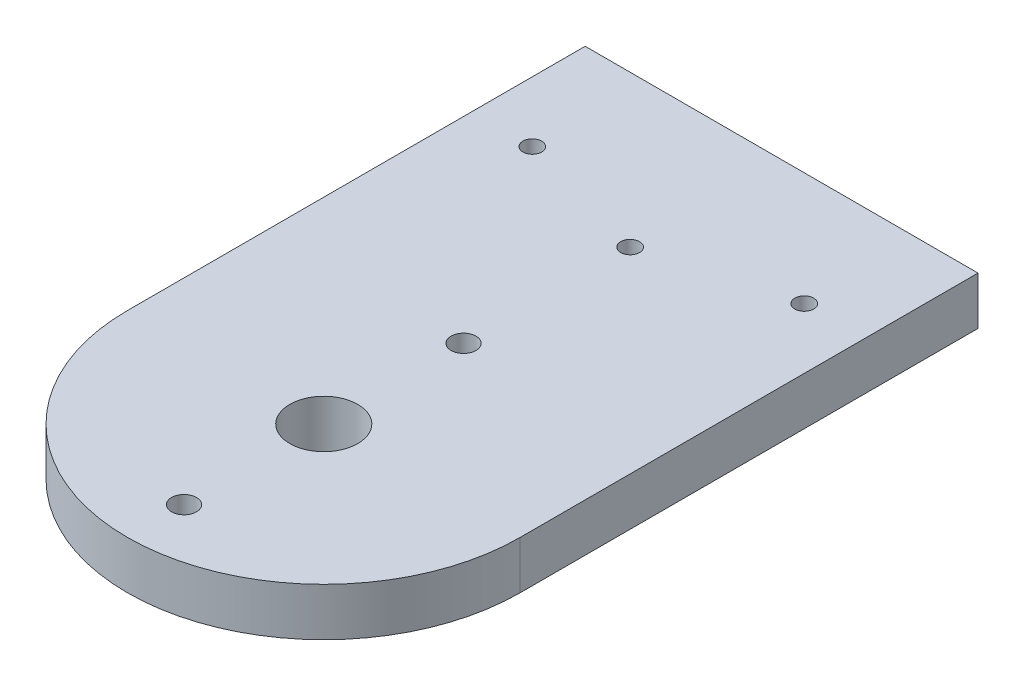
ISO-10303-21;
HEADER;
FILE_DESCRIPTION(('STEP AP214'),'2;1');
FILE_NAME('part.step','',(''),(''),'','','');
FILE_SCHEMA(('AUTOMOTIVE_DESIGN { 1 0 10303 214 1 1 1 1 }'));
ENDSEC;
DATA;
#1=APPLICATION_CONTEXT('core data for automotive mechanical design processes');
#2=APPLICATION_PROTOCOL_DEFINITION('international standard','automotive_design',2000,#1);
#3=PRODUCT_CONTEXT('',#1,'mechanical');
#4=PRODUCT('Part','Part','',(#3));
#5=PRODUCT_RELATED_PRODUCT_CATEGORY('part','',(#4));
#6=PRODUCT_DEFINITION_FORMATION('','',#4);
#7=PRODUCT_DEFINITION_CONTEXT('part definition',#1,'design');
#8=PRODUCT_DEFINITION('design','',#6,#7);
#9=PRODUCT_DEFINITION_SHAPE('','',#8);
#10=(LENGTH_UNIT() NAMED_UNIT(*) SI_UNIT(.MILLI.,.METRE.));
#11=(NAMED_UNIT(*) PLANE_ANGLE_UNIT() SI_UNIT($,.RADIAN.));
#12=(NAMED_UNIT(*) SI_UNIT($,.STERADIAN.) SOLID_ANGLE_UNIT());
#13=UNCERTAINTY_MEASURE_WITH_UNIT(LENGTH_MEASURE(1.E-05),#10,'distance_accuracy_value','');
#14=(GEOMETRIC_REPRESENTATION_CONTEXT(3) GLOBAL_UNCERTAINTY_ASSIGNED_CONTEXT((#13)) GLOBAL_UNIT_ASSIGNED_CONTEXT((#10,
#11,#12)) REPRESENTATION_CONTEXT('',''));
#15=CARTESIAN_POINT('',(0.,0.,0.));
#16=DIRECTION('',(0.,0.,1.));
#17=DIRECTION('',(1.,0.,0.));
#18=AXIS2_PLACEMENT_3D('',#15,#16,#17);
#19=CARTESIAN_POINT('',(126.4,-4.175,275.95));
#20=DIRECTION('',(1.,0.,0.));
#21=DIRECTION('',(0.,0.,-1.));
#22=AXIS2_PLACEMENT_3D('',#19,#20,#21);
#23=PLANE('',#22);
#24=DIRECTION('',(0.,0.,1.));
#25=VECTOR('',#24,1.);
#26=CARTESIAN_POINT('',(126.4,-10.525,275.95));
#27=LINE('',#26,#25);
#28=CARTESIAN_POINT('',(126.4,-10.525,275.95));
#29=VERTEX_POINT('',#28);
#30=CARTESIAN_POINT('',(126.4,-10.525,336.55));
#31=VERTEX_POINT('',#30);
#32=EDGE_CURVE('E92',#29,#31,#27,.T.);
#33=ORIENTED_EDGE('',*,*,#32,.T.);
#34=DIRECTION('',(0.,-1.,0.));
#35=VECTOR('',#34,1.);
#36=CARTESIAN_POINT('',(126.4,-4.175,336.55));
#37=LINE('',#36,#35);
#38=CARTESIAN_POINT('',(126.4,-4.175,336.55));
#39=VERTEX_POINT('',#38);
#40=EDGE_CURVE('E11',#39,#31,#37,.T.);
#41=ORIENTED_EDGE('',*,*,#40,.F.);
#42=DIRECTION('',(0.,0.,1.));
#43=VECTOR('',#42,1.);
#44=CARTESIAN_POINT('',(126.4,-4.175,275.95));
#45=LINE('',#44,#43);
#46=CARTESIAN_POINT('',(126.4,-4.175,275.95));
#47=VERTEX_POINT('',#46);
#48=EDGE_CURVE('E90',#47,#39,#45,.T.);
#49=ORIENTED_EDGE('',*,*,#48,.F.);
#50=DIRECTION('',(0.,-1.,0.));
#51=VECTOR('',#50,1.);
#52=CARTESIAN_POINT('',(126.4,-4.175,275.95));
#53=LINE('',#52,#51);
#54=EDGE_CURVE('E81',#47,#29,#53,.T.);
#55=ORIENTED_EDGE('',*,*,#54,.T.);
#56=EDGE_LOOP('',(#33,#41,#49,#55));
#57=FACE_BOUND('',#56,.T.);
#58=ADVANCED_FACE('F44',(#57),#23,.F.);
#59=CARTESIAN_POINT('',(178.4,-4.175,275.95));
#60=DIRECTION('',(-1.,0.,0.));
#61=DIRECTION('',(0.,0.,1.));
#62=AXIS2_PLACEMENT_3D('',#59,#60,#61);
#63=PLANE('',#62);
#64=DIRECTION('',(0.,0.,-1.));
#65=VECTOR('',#64,1.);
#66=CARTESIAN_POINT('',(178.4,-10.525,275.95));
#67=LINE('',#66,#65);
#68=CARTESIAN_POINT('',(178.4,-10.525,336.55));
#69=VERTEX_POINT('',#68);
#70=CARTESIAN_POINT('',(178.4,-10.525,275.95));
#71=VERTEX_POINT('',#70);
#72=EDGE_CURVE('E77',#69,#71,#67,.T.);
#73=ORIENTED_EDGE('',*,*,#72,.T.);
#74=DIRECTION('',(0.,-1.,0.));
#75=VECTOR('',#74,1.);
#76=CARTESIAN_POINT('',(178.4,-4.175,275.95));
#77=LINE('',#76,#75);
#78=CARTESIAN_POINT('',(178.4,-4.175,275.95));
#79=VERTEX_POINT('',#78);
#80=EDGE_CURVE('E86',#79,#71,#77,.T.);
#81=ORIENTED_EDGE('',*,*,#80,.F.);
#82=DIRECTION('',(0.,0.,-1.));
#83=VECTOR('',#82,1.);
#84=CARTESIAN_POINT('',(178.4,-4.175,275.95));
#85=LINE('',#84,#83);
#86=CARTESIAN_POINT('',(178.4,-4.175,336.55));
#87=VERTEX_POINT('',#86);
#88=EDGE_CURVE('E117',#87,#79,#85,.T.);
#89=ORIENTED_EDGE('',*,*,#88,.F.);
#90=DIRECTION('',(0.,-1.,0.));
#91=VECTOR('',#90,1.);
#92=CARTESIAN_POINT('',(178.4,-4.175,336.55));
#93=LINE('',#92,#91);
#94=EDGE_CURVE('E53',#87,#69,#93,.T.);
#95=ORIENTED_EDGE('',*,*,#94,.T.);
#96=EDGE_LOOP('',(#73,#81,#89,#95));
#97=FACE_BOUND('',#96,.T.);
#98=ADVANCED_FACE('F116',(#97),#63,.F.);
#99=CARTESIAN_POINT('',(126.4,-4.175,275.95));
#100=DIRECTION('',(0.,0.,1.));
#101=DIRECTION('',(1.,0.,0.));
#102=AXIS2_PLACEMENT_3D('',#99,#100,#101);
#103=PLANE('',#102);
#104=CARTESIAN_POINT('',(130.4,-7.35,275.95));
#105=DIRECTION('',(0.,0.,1.));
#106=DIRECTION('',(1.,0.,0.));
#107=AXIS2_PLACEMENT_3D('',#104,#105,#106);
#108=CIRCLE('',#107,2.);
#109=CARTESIAN_POINT('',(132.4,-7.35,275.95));
#110=VERTEX_POINT('',#109);
#111=EDGE_CURVE('E185',#110,#110,#108,.T.);
#112=ORIENTED_EDGE('',*,*,#111,.T.);
#113=EDGE_LOOP('',(#112));
#114=FACE_BOUND('',#113,.T.);
#115=CARTESIAN_POINT('',(174.4,-7.35,275.95));
#116=DIRECTION('',(0.,0.,1.));
#117=DIRECTION('',(1.,0.,0.));
#118=AXIS2_PLACEMENT_3D('',#115,#116,#117);
#119=CIRCLE('',#118,2.);
#120=CARTESIAN_POINT('',(176.4,-7.35,275.95));
#121=VERTEX_POINT('',#120);
#122=EDGE_CURVE('E180',#121,#121,#119,.T.);
#123=ORIENTED_EDGE('',*,*,#122,.T.);
#124=EDGE_LOOP('',(#123));
#125=FACE_BOUND('',#124,.T.);
#126=DIRECTION('',(-1.,0.,0.));
#127=VECTOR('',#126,1.);
#128=CARTESIAN_POINT('',(126.4,-10.525,275.95));
#129=LINE('',#128,#127);
#130=EDGE_CURVE('E82',#71,#29,#129,.T.);
#131=ORIENTED_EDGE('',*,*,#130,.T.);
#132=ORIENTED_EDGE('',*,*,#54,.F.);
#133=DIRECTION('',(-1.,0.,0.));
#134=VECTOR('',#133,1.);
#135=CARTESIAN_POINT('',(126.4,-4.175,275.95));
#136=LINE('',#135,#134);
#137=EDGE_CURVE('E65',#79,#47,#136,.T.);
#138=ORIENTED_EDGE('',*,*,#137,.F.);
#139=ORIENTED_EDGE('',*,*,#80,.T.);
#140=EDGE_LOOP('',(#131,#132,#138,#139));
#141=FACE_BOUND('',#140,.T.);
#142=ADVANCED_FACE('F84',(#114,#125,#141),#103,.F.);
#143=CARTESIAN_POINT('',(0.,-4.175,0.));
#144=DIRECTION('',(0.,1.,0.));
#145=DIRECTION('',(0.,0.,1.));
#146=AXIS2_PLACEMENT_3D('',#143,#144,#145);
#147=PLANE('',#146);
#148=CARTESIAN_POINT('',(152.4,-4.175,296.));
#149=DIRECTION('',(0.,1.,0.));
#150=DIRECTION('',(0.,0.,1.));
#151=AXIS2_PLACEMENT_3D('',#148,#149,#150);
#152=CIRCLE('',#151,1.25);
#153=CARTESIAN_POINT('',(152.4,-4.175,294.75));
#154=VERTEX_POINT('',#153);
#155=EDGE_CURVE('E178',#154,#154,#152,.T.);
#156=ORIENTED_EDGE('',*,*,#155,.F.);
#157=EDGE_LOOP('',(#156));
#158=FACE_BOUND('',#157,.T.);
#159=CARTESIAN_POINT('',(134.4,-4.175,290.95));
#160=DIRECTION('',(0.,1.,0.));
#161=DIRECTION('',(0.,0.,1.));
#162=AXIS2_PLACEMENT_3D('',#159,#160,#161);
#163=CIRCLE('',#162,1.25);
#164=CARTESIAN_POINT('',(134.4,-4.175,289.7));
#165=VERTEX_POINT('',#164);
#166=EDGE_CURVE('E147',#165,#165,#163,.T.);
#167=ORIENTED_EDGE('',*,*,#166,.F.);
#168=EDGE_LOOP('',(#167));
#169=FACE_BOUND('',#168,.T.);
#170=CARTESIAN_POINT('',(170.4,-4.175,290.95));
#171=DIRECTION('',(0.,1.,0.));
#172=DIRECTION('',(0.,0.,1.));
#173=AXIS2_PLACEMENT_3D('',#170,#171,#172);
#174=CIRCLE('',#173,1.25);
#175=CARTESIAN_POINT('',(170.4,-4.175,289.7));
#176=VERTEX_POINT('',#175);
#177=EDGE_CURVE('E160',#176,#176,#174,.T.);
#178=ORIENTED_EDGE('',*,*,#177,.F.);
#179=EDGE_LOOP('',(#178));
#180=FACE_BOUND('',#179,.T.);
#181=CARTESIAN_POINT('',(152.4,-4.175,318.05));
#182=DIRECTION('',(0.,1.,0.));
#183=DIRECTION('',(0.,0.,1.));
#184=AXIS2_PLACEMENT_3D('',#181,#182,#183);
#185=CIRCLE('',#184,1.65000000000001);
#186=CARTESIAN_POINT('',(152.4,-4.175,316.4));
#187=VERTEX_POINT('',#186);
#188=EDGE_CURVE('E142',#187,#187,#185,.T.);
#189=ORIENTED_EDGE('',*,*,#188,.F.);
#190=EDGE_LOOP('',(#189));
#191=FACE_BOUND('',#190,.T.);
#192=CARTESIAN_POINT('',(152.4,-4.175,355.05));
#193=DIRECTION('',(0.,1.,0.));
#194=DIRECTION('',(0.,0.,1.));
#195=AXIS2_PLACEMENT_3D('',#192,#193,#194);
#196=CIRCLE('',#195,1.65000000000001);
#197=CARTESIAN_POINT('',(152.4,-4.175,353.4));
#198=VERTEX_POINT('',#197);
#199=EDGE_CURVE('E148',#198,#198,#196,.T.);
#200=ORIENTED_EDGE('',*,*,#199,.F.);
#201=EDGE_LOOP('',(#200));
#202=FACE_BOUND('',#201,.T.);
#203=CARTESIAN_POINT('',(152.4,-4.175,336.55));
#204=DIRECTION('',(0.,1.,0.));
#205=DIRECTION('',(0.,0.,1.));
#206=AXIS2_PLACEMENT_3D('',#203,#204,#205);
#207=CIRCLE('',#206,4.5);
#208=CARTESIAN_POINT('',(152.4,-4.175,332.05));
#209=VERTEX_POINT('',#208);
#210=EDGE_CURVE('E131',#209,#209,#207,.T.);
#211=ORIENTED_EDGE('',*,*,#210,.F.);
#212=EDGE_LOOP('',(#211));
#213=FACE_BOUND('',#212,.T.);
#214=ORIENTED_EDGE('',*,*,#48,.T.);
#215=CARTESIAN_POINT('',(152.4,-4.175,336.55));
#216=DIRECTION('',(0.,1.,0.));
#217=DIRECTION('',(0.,0.,1.));
#218=AXIS2_PLACEMENT_3D('',#215,#216,#217);
#219=CIRCLE('',#218,26.);
#220=EDGE_CURVE('E105',#39,#87,#219,.T.);
#221=ORIENTED_EDGE('',*,*,#220,.T.);
#222=ORIENTED_EDGE('',*,*,#88,.T.);
#223=ORIENTED_EDGE('',*,*,#137,.T.);
#224=EDGE_LOOP('',(#214,#221,#222,#223));
#225=FACE_BOUND('',#224,.T.);
#226=ADVANCED_FACE('F121',(#158,#169,#180,#191,#202,#213,#225),#147,.T.);
#227=CARTESIAN_POINT('',(0.,-10.525,0.));
#228=DIRECTION('',(0.,1.,0.));
#229=DIRECTION('',(0.,0.,1.));
#230=AXIS2_PLACEMENT_3D('',#227,#228,#229);
#231=PLANE('',#230);
#232=CARTESIAN_POINT('',(152.4,-10.525,296.));
#233=DIRECTION('',(0.,1.,0.));
#234=DIRECTION('',(0.,0.,1.));
#235=AXIS2_PLACEMENT_3D('',#232,#233,#234);
#236=CIRCLE('',#235,1.25);
#237=CARTESIAN_POINT('',(152.4,-10.525,294.75));
#238=VERTEX_POINT('',#237);
#239=EDGE_CURVE('E186',#238,#238,#236,.T.);
#240=ORIENTED_EDGE('',*,*,#239,.T.);
#241=EDGE_LOOP('',(#240));
#242=FACE_BOUND('',#241,.T.);
#243=CARTESIAN_POINT('',(134.4,-10.525,290.95));
#244=DIRECTION('',(0.,1.,0.));
#245=DIRECTION('',(0.,0.,1.));
#246=AXIS2_PLACEMENT_3D('',#243,#244,#245);
#247=CIRCLE('',#246,1.25);
#248=CARTESIAN_POINT('',(134.4,-10.525,289.7));
#249=VERTEX_POINT('',#248);
#250=EDGE_CURVE('E168',#249,#249,#247,.T.);
#251=ORIENTED_EDGE('',*,*,#250,.T.);
#252=EDGE_LOOP('',(#251));
#253=FACE_BOUND('',#252,.T.);
#254=CARTESIAN_POINT('',(170.4,-10.525,290.95));
#255=DIRECTION('',(0.,1.,0.));
#256=DIRECTION('',(0.,0.,1.));
#257=AXIS2_PLACEMENT_3D('',#254,#255,#256);
#258=CIRCLE('',#257,1.25);
#259=CARTESIAN_POINT('',(170.4,-10.525,289.7));
#260=VERTEX_POINT('',#259);
#261=EDGE_CURVE('E163',#260,#260,#258,.T.);
#262=ORIENTED_EDGE('',*,*,#261,.T.);
#263=EDGE_LOOP('',(#262));
#264=FACE_BOUND('',#263,.T.);
#265=CARTESIAN_POINT('',(152.4,-10.525,318.05));
#266=DIRECTION('',(0.,1.,0.));
#267=DIRECTION('',(0.,0.,1.));
#268=AXIS2_PLACEMENT_3D('',#265,#266,#267);
#269=CIRCLE('',#268,1.65000000000001);
#270=CARTESIAN_POINT('',(152.4,-10.525,316.4));
#271=VERTEX_POINT('',#270);
#272=EDGE_CURVE('E143',#271,#271,#269,.T.);
#273=ORIENTED_EDGE('',*,*,#272,.T.);
#274=EDGE_LOOP('',(#273));
#275=FACE_BOUND('',#274,.T.);
#276=CARTESIAN_POINT('',(152.4,-10.525,355.05));
#277=DIRECTION('',(0.,1.,0.));
#278=DIRECTION('',(0.,0.,1.));
#279=AXIS2_PLACEMENT_3D('',#276,#277,#278);
#280=CIRCLE('',#279,1.65000000000001);
#281=CARTESIAN_POINT('',(152.4,-10.525,353.4));
#282=VERTEX_POINT('',#281);
#283=EDGE_CURVE('E140',#282,#282,#280,.T.);
#284=ORIENTED_EDGE('',*,*,#283,.T.);
#285=EDGE_LOOP('',(#284));
#286=FACE_BOUND('',#285,.T.);
#287=CARTESIAN_POINT('',(152.4,-10.525,336.55));
#288=DIRECTION('',(0.,1.,0.));
#289=DIRECTION('',(0.,0.,1.));
#290=AXIS2_PLACEMENT_3D('',#287,#288,#289);
#291=CIRCLE('',#290,4.5);
#292=CARTESIAN_POINT('',(152.4,-10.525,332.05));
#293=VERTEX_POINT('',#292);
#294=EDGE_CURVE('E134',#293,#293,#291,.T.);
#295=ORIENTED_EDGE('',*,*,#294,.T.);
#296=EDGE_LOOP('',(#295));
#297=FACE_BOUND('',#296,.T.);
#298=ORIENTED_EDGE('',*,*,#72,.F.);
#299=CARTESIAN_POINT('',(152.4,-10.525,336.55));
#300=DIRECTION('',(0.,1.,0.));
#301=DIRECTION('',(0.,0.,1.));
#302=AXIS2_PLACEMENT_3D('',#299,#300,#301);
#303=CIRCLE('',#302,26.);
#304=EDGE_CURVE('E99',#31,#69,#303,.T.);
#305=ORIENTED_EDGE('',*,*,#304,.F.);
#306=ORIENTED_EDGE('',*,*,#32,.F.);
#307=ORIENTED_EDGE('',*,*,#130,.F.);
#308=EDGE_LOOP('',(#298,#305,#306,#307));
#309=FACE_BOUND('',#308,.T.);
#310=ADVANCED_FACE('F100',(#242,#253,#264,#275,#286,#297,#309),#231,.F.);
#311=CARTESIAN_POINT('',(152.4,-4.175,336.55));
#312=DIRECTION('',(0.,-1.,0.));
#313=DIRECTION('',(0.,0.,-1.));
#314=AXIS2_PLACEMENT_3D('',#311,#312,#313);
#315=CYLINDRICAL_SURFACE('',#314,26.);
#316=ORIENTED_EDGE('',*,*,#220,.F.);
#317=ORIENTED_EDGE('',*,*,#40,.T.);
#318=ORIENTED_EDGE('',*,*,#304,.T.);
#319=ORIENTED_EDGE('',*,*,#94,.F.);
#320=EDGE_LOOP('',(#316,#317,#318,#319));
#321=FACE_BOUND('',#320,.T.);
#322=ADVANCED_FACE('F122',(#321),#315,.T.);
#323=CARTESIAN_POINT('',(152.4,-4.175,336.55));
#324=DIRECTION('',(0.,-1.,0.));
#325=DIRECTION('',(0.,0.,-1.));
#326=AXIS2_PLACEMENT_3D('',#323,#324,#325);
#327=CYLINDRICAL_SURFACE('',#326,4.5);
#328=CARTESIAN_POINT('',(152.4,-4.175,332.05));
#329=CARTESIAN_POINT('',(152.4,-4.24114583333333,332.05));
#330=CARTESIAN_POINT('',(152.4,-4.30729166666667,332.05));
#331=CARTESIAN_POINT('',(152.4,-4.43958333333333,332.05));
#332=CARTESIAN_POINT('',(152.4,-4.50572916666667,332.05));
#333=CARTESIAN_POINT('',(152.4,-4.63802083333333,332.05));
#334=CARTESIAN_POINT('',(152.4,-4.70416666666667,332.05));
#335=CARTESIAN_POINT('',(152.4,-4.83645833333333,332.05));
#336=CARTESIAN_POINT('',(152.4,-4.90260416666667,332.05));
#337=CARTESIAN_POINT('',(152.4,-5.03489583333333,332.05));
#338=CARTESIAN_POINT('',(152.4,-5.10104166666667,332.05));
#339=CARTESIAN_POINT('',(152.4,-5.23333333333333,332.05));
#340=CARTESIAN_POINT('',(152.4,-5.29947916666667,332.05));
#341=CARTESIAN_POINT('',(152.4,-5.43177083333333,332.05));
#342=CARTESIAN_POINT('',(152.4,-5.49791666666667,332.05));
#343=CARTESIAN_POINT('',(152.4,-5.63020833333333,332.05));
#344=CARTESIAN_POINT('',(152.4,-5.69635416666667,332.05));
#345=CARTESIAN_POINT('',(152.4,-5.82864583333333,332.05));
#346=CARTESIAN_POINT('',(152.4,-5.89479166666667,332.05));
#347=CARTESIAN_POINT('',(152.4,-6.02708333333333,332.05));
#348=CARTESIAN_POINT('',(152.4,-6.09322916666667,332.05));
#349=CARTESIAN_POINT('',(152.4,-6.22552083333333,332.05));
#350=CARTESIAN_POINT('',(152.4,-6.29166666666667,332.05));
#351=CARTESIAN_POINT('',(152.4,-6.42395833333333,332.05));
#352=CARTESIAN_POINT('',(152.4,-6.49010416666667,332.05));
#353=CARTESIAN_POINT('',(152.4,-6.62239583333333,332.05));
#354=CARTESIAN_POINT('',(152.4,-6.68854166666667,332.05));
#355=CARTESIAN_POINT('',(152.4,-6.82083333333333,332.05));
#356=CARTESIAN_POINT('',(152.4,-6.88697916666667,332.05));
#357=CARTESIAN_POINT('',(152.4,-7.01927083333333,332.05));
#358=CARTESIAN_POINT('',(152.4,-7.08541666666667,332.05));
#359=CARTESIAN_POINT('',(152.4,-7.21770833333333,332.05));
#360=CARTESIAN_POINT('',(152.4,-7.28385416666667,332.05));
#361=CARTESIAN_POINT('',(152.4,-7.41614583333333,332.05));
#362=CARTESIAN_POINT('',(152.4,-7.48229166666667,332.05));
#363=CARTESIAN_POINT('',(152.4,-7.61458333333333,332.05));
#364=CARTESIAN_POINT('',(152.4,-7.68072916666667,332.05));
#365=CARTESIAN_POINT('',(152.4,-7.81302083333333,332.05));
#366=CARTESIAN_POINT('',(152.4,-7.87916666666667,332.05));
#367=CARTESIAN_POINT('',(152.4,-8.01145833333333,332.05));
#368=CARTESIAN_POINT('',(152.4,-8.07760416666667,332.05));
#369=CARTESIAN_POINT('',(152.4,-8.20989583333333,332.05));
#370=CARTESIAN_POINT('',(152.4,-8.27604166666667,332.05));
#371=CARTESIAN_POINT('',(152.4,-8.40833333333333,332.05));
#372=CARTESIAN_POINT('',(152.4,-8.47447916666667,332.05));
#373=CARTESIAN_POINT('',(152.4,-8.60677083333333,332.05));
#374=CARTESIAN_POINT('',(152.4,-8.67291666666667,332.05));
#375=CARTESIAN_POINT('',(152.4,-8.80520833333333,332.05));
#376=CARTESIAN_POINT('',(152.4,-8.87135416666667,332.05));
#377=CARTESIAN_POINT('',(152.4,-9.00364583333333,332.05));
#378=CARTESIAN_POINT('',(152.4,-9.06979166666667,332.05));
#379=CARTESIAN_POINT('',(152.4,-9.20208333333333,332.05));
#380=CARTESIAN_POINT('',(152.4,-9.26822916666667,332.05));
#381=CARTESIAN_POINT('',(152.4,-9.40052083333333,332.05));
#382=CARTESIAN_POINT('',(152.4,-9.46666666666667,332.05));
#383=CARTESIAN_POINT('',(152.4,-9.59895833333333,332.05));
#384=CARTESIAN_POINT('',(152.4,-9.66510416666667,332.05));
#385=CARTESIAN_POINT('',(152.4,-9.79739583333333,332.05));
#386=CARTESIAN_POINT('',(152.4,-9.86354166666667,332.05));
#387=CARTESIAN_POINT('',(152.4,-9.99583333333333,332.05));
#388=CARTESIAN_POINT('',(152.4,-10.0619791666667,332.05));
#389=CARTESIAN_POINT('',(152.4,-10.1942708333333,332.05));
#390=CARTESIAN_POINT('',(152.4,-10.2604166666667,332.05));
#391=CARTESIAN_POINT('',(152.4,-10.3927083333333,332.05));
#392=CARTESIAN_POINT('',(152.4,-10.4588541666667,332.05));
#393=CARTESIAN_POINT('',(152.4,-10.525,332.05));
#394=B_SPLINE_CURVE_WITH_KNOTS('',3,(#328,#329,#330,#331,#332,#333,#334,#335,#336,#337,#338,
#339,#340,#341,#342,#343,#344,#345,#346,#347,#348,#349,#350,#351,#352,#353,#354,#355,#356,#357,
#358,#359,#360,#361,#362,#363,#364,#365,#366,#367,#368,#369,#370,#371,#372,#373,#374,#375,#376,
#377,#378,#379,#380,#381,#382,#383,#384,#385,#386,#387,#388,#389,#390,#391,#392,#393),
.UNSPECIFIED.,.F.,.F.,(4,2,2,2,2,2,2,2,2,2,2,2,2,2,2,2,2,2,2,2,2,2,2,2,2,2,2,2,2,2,2,2,4),(0.,
0.1984375,0.396875,0.595312499999999,0.793749999999999,0.992187499999999,1.190625,1.3890625,
1.5875,1.7859375,1.984375,2.1828125,2.38125,2.5796875,2.778125,2.9765625,3.175,3.3734375,
3.571875,3.7703125,3.96875,4.1671875,4.365625,4.5640625,4.7625,4.9609375,5.159375,5.3578125,
5.55625,5.7546875,5.953125,6.1515625,6.35),.UNSPECIFIED.);
#395=EDGE_CURVE('BSEAM214',#209,#293,#394,.T.);
#396=ORIENTED_EDGE('',*,*,#210,.T.);
#397=ORIENTED_EDGE('',*,*,#294,.F.);
#398=ORIENTED_EDGE('',*,*,#395,.T.);
#399=ORIENTED_EDGE('',*,*,#395,.F.);
#400=EDGE_LOOP('',(#396,#398,#397,#399));
#401=FACE_BOUND('',#400,.T.);
#402=ADVANCED_FACE('F214',(#401),#327,.F.);
#403=CARTESIAN_POINT('',(152.4,-4.175,355.05));
#404=DIRECTION('',(0.,-1.,0.));
#405=DIRECTION('',(0.,0.,-1.));
#406=AXIS2_PLACEMENT_3D('',#403,#404,#405);
#407=CYLINDRICAL_SURFACE('',#406,1.65000000000001);
#408=CARTESIAN_POINT('',(152.4,-4.175,353.4));
#409=CARTESIAN_POINT('',(152.4,-4.24114583333333,353.4));
#410=CARTESIAN_POINT('',(152.4,-4.30729166666667,353.4));
#411=CARTESIAN_POINT('',(152.4,-4.43958333333333,353.4));
#412=CARTESIAN_POINT('',(152.4,-4.50572916666667,353.4));
#413=CARTESIAN_POINT('',(152.4,-4.63802083333333,353.4));
#414=CARTESIAN_POINT('',(152.4,-4.70416666666667,353.4));
#415=CARTESIAN_POINT('',(152.4,-4.83645833333333,353.4));
#416=CARTESIAN_POINT('',(152.4,-4.90260416666667,353.4));
#417=CARTESIAN_POINT('',(152.4,-5.03489583333333,353.4));
#418=CARTESIAN_POINT('',(152.4,-5.10104166666667,353.4));
#419=CARTESIAN_POINT('',(152.4,-5.23333333333333,353.4));
#420=CARTESIAN_POINT('',(152.4,-5.29947916666667,353.4));
#421=CARTESIAN_POINT('',(152.4,-5.43177083333333,353.4));
#422=CARTESIAN_POINT('',(152.4,-5.49791666666667,353.4));
#423=CARTESIAN_POINT('',(152.4,-5.63020833333333,353.4));
#424=CARTESIAN_POINT('',(152.4,-5.69635416666667,353.4));
#425=CARTESIAN_POINT('',(152.4,-5.82864583333333,353.4));
#426=CARTESIAN_POINT('',(152.4,-5.89479166666667,353.4));
#427=CARTESIAN_POINT('',(152.4,-6.02708333333333,353.4));
#428=CARTESIAN_POINT('',(152.4,-6.09322916666667,353.4));
#429=CARTESIAN_POINT('',(152.4,-6.22552083333333,353.4));
#430=CARTESIAN_POINT('',(152.4,-6.29166666666667,353.4));
#431=CARTESIAN_POINT('',(152.4,-6.42395833333333,353.4));
#432=CARTESIAN_POINT('',(152.4,-6.49010416666667,353.4));
#433=CARTESIAN_POINT('',(152.4,-6.62239583333333,353.4));
#434=CARTESIAN_POINT('',(152.4,-6.68854166666667,353.4));
#435=CARTESIAN_POINT('',(152.4,-6.82083333333333,353.4));
#436=CARTESIAN_POINT('',(152.4,-6.88697916666667,353.4));
#437=CARTESIAN_POINT('',(152.4,-7.01927083333333,353.4));
#438=CARTESIAN_POINT('',(152.4,-7.08541666666667,353.4));
#439=CARTESIAN_POINT('',(152.4,-7.21770833333333,353.4));
#440=CARTESIAN_POINT('',(152.4,-7.28385416666667,353.4));
#441=CARTESIAN_POINT('',(152.4,-7.41614583333333,353.4));
#442=CARTESIAN_POINT('',(152.4,-7.48229166666667,353.4));
#443=CARTESIAN_POINT('',(152.4,-7.61458333333333,353.4));
#444=CARTESIAN_POINT('',(152.4,-7.68072916666667,353.4));
#445=CARTESIAN_POINT('',(152.4,-7.81302083333333,353.4));
#446=CARTESIAN_POINT('',(152.4,-7.87916666666667,353.4));
#447=CARTESIAN_POINT('',(152.4,-8.01145833333333,353.4));
#448=CARTESIAN_POINT('',(152.4,-8.07760416666667,353.4));
#449=CARTESIAN_POINT('',(152.4,-8.20989583333333,353.4));
#450=CARTESIAN_POINT('',(152.4,-8.27604166666667,353.4));
#451=CARTESIAN_POINT('',(152.4,-8.40833333333333,353.4));
#452=CARTESIAN_POINT('',(152.4,-8.47447916666667,353.4));
#453=CARTESIAN_POINT('',(152.4,-8.60677083333333,353.4));
#454=CARTESIAN_POINT('',(152.4,-8.67291666666667,353.4));
#455=CARTESIAN_POINT('',(152.4,-8.80520833333333,353.4));
#456=CARTESIAN_POINT('',(152.4,-8.87135416666667,353.4));
#457=CARTESIAN_POINT('',(152.4,-9.00364583333333,353.4));
#458=CARTESIAN_POINT('',(152.4,-9.06979166666667,353.4));
#459=CARTESIAN_POINT('',(152.4,-9.20208333333333,353.4));
#460=CARTESIAN_POINT('',(152.4,-9.26822916666667,353.4));
#461=CARTESIAN_POINT('',(152.4,-9.40052083333333,353.4));
#462=CARTESIAN_POINT('',(152.4,-9.46666666666667,353.4));
#463=CARTESIAN_POINT('',(152.4,-9.59895833333333,353.4));
#464=CARTESIAN_POINT('',(152.4,-9.66510416666667,353.4));
#465=CARTESIAN_POINT('',(152.4,-9.79739583333333,353.4));
#466=CARTESIAN_POINT('',(152.4,-9.86354166666667,353.4));
#467=CARTESIAN_POINT('',(152.4,-9.99583333333333,353.4));
#468=CARTESIAN_POINT('',(152.4,-10.0619791666667,353.4));
#469=CARTESIAN_POINT('',(152.4,-10.1942708333333,353.4));
#470=CARTESIAN_POINT('',(152.4,-10.2604166666667,353.4));
#471=CARTESIAN_POINT('',(152.4,-10.3927083333333,353.4));
#472=CARTESIAN_POINT('',(152.4,-10.4588541666667,353.4));
#473=CARTESIAN_POINT('',(152.4,-10.525,353.4));
#474=B_SPLINE_CURVE_WITH_KNOTS('',3,(#408,#409,#410,#411,#412,#413,#414,#415,#416,#417,#418,
#419,#420,#421,#422,#423,#424,#425,#426,#427,#428,#429,#430,#431,#432,#433,#434,#435,#436,#437,
#438,#439,#440,#441,#442,#443,#444,#445,#446,#447,#448,#449,#450,#451,#452,#453,#454,#455,#456,
#457,#458,#459,#460,#461,#462,#463,#464,#465,#466,#467,#468,#469,#470,#471,#472,#473),
.UNSPECIFIED.,.F.,.F.,(4,2,2,2,2,2,2,2,2,2,2,2,2,2,2,2,2,2,2,2,2,2,2,2,2,2,2,2,2,2,2,2,4),(0.,
0.1984375,0.396875,0.595312499999999,0.793749999999999,0.992187499999999,1.190625,1.3890625,
1.5875,1.7859375,1.984375,2.1828125,2.38125,2.5796875,2.778125,2.9765625,3.175,3.3734375,
3.571875,3.7703125,3.96875,4.1671875,4.365625,4.5640625,4.7625,4.9609375,5.159375,5.3578125,
5.55625,5.7546875,5.953125,6.1515625,6.35),.UNSPECIFIED.);
#475=EDGE_CURVE('BSEAM216',#198,#282,#474,.T.);
#476=ORIENTED_EDGE('',*,*,#199,.T.);
#477=ORIENTED_EDGE('',*,*,#283,.F.);
#478=ORIENTED_EDGE('',*,*,#475,.T.);
#479=ORIENTED_EDGE('',*,*,#475,.F.);
#480=EDGE_LOOP('',(#476,#478,#477,#479));
#481=FACE_BOUND('',#480,.T.);
#482=ADVANCED_FACE('F216',(#481),#407,.F.);
#483=CARTESIAN_POINT('',(152.4,-4.175,318.05));
#484=DIRECTION('',(0.,-1.,0.));
#485=DIRECTION('',(0.,0.,-1.));
#486=AXIS2_PLACEMENT_3D('',#483,#484,#485);
#487=CYLINDRICAL_SURFACE('',#486,1.65000000000001);
#488=CARTESIAN_POINT('',(152.4,-4.175,316.4));
#489=CARTESIAN_POINT('',(152.4,-4.24114583333333,316.4));
#490=CARTESIAN_POINT('',(152.4,-4.30729166666667,316.4));
#491=CARTESIAN_POINT('',(152.4,-4.43958333333333,316.4));
#492=CARTESIAN_POINT('',(152.4,-4.50572916666667,316.4));
#493=CARTESIAN_POINT('',(152.4,-4.63802083333333,316.4));
#494=CARTESIAN_POINT('',(152.4,-4.70416666666667,316.4));
#495=CARTESIAN_POINT('',(152.4,-4.83645833333333,316.4));
#496=CARTESIAN_POINT('',(152.4,-4.90260416666667,316.4));
#497=CARTESIAN_POINT('',(152.4,-5.03489583333333,316.4));
#498=CARTESIAN_POINT('',(152.4,-5.10104166666667,316.4));
#499=CARTESIAN_POINT('',(152.4,-5.23333333333333,316.4));
#500=CARTESIAN_POINT('',(152.4,-5.29947916666667,316.4));
#501=CARTESIAN_POINT('',(152.4,-5.43177083333333,316.4));
#502=CARTESIAN_POINT('',(152.4,-5.49791666666667,316.4));
#503=CARTESIAN_POINT('',(152.4,-5.63020833333333,316.4));
#504=CARTESIAN_POINT('',(152.4,-5.69635416666667,316.4));
#505=CARTESIAN_POINT('',(152.4,-5.82864583333333,316.4));
#506=CARTESIAN_POINT('',(152.4,-5.89479166666667,316.4));
#507=CARTESIAN_POINT('',(152.4,-6.02708333333333,316.4));
#508=CARTESIAN_POINT('',(152.4,-6.09322916666667,316.4));
#509=CARTESIAN_POINT('',(152.4,-6.22552083333333,316.4));
#510=CARTESIAN_POINT('',(152.4,-6.29166666666667,316.4));
#511=CARTESIAN_POINT('',(152.4,-6.42395833333333,316.4));
#512=CARTESIAN_POINT('',(152.4,-6.49010416666667,316.4));
#513=CARTESIAN_POINT('',(152.4,-6.62239583333333,316.4));
#514=CARTESIAN_POINT('',(152.4,-6.68854166666667,316.4));
#515=CARTESIAN_POINT('',(152.4,-6.82083333333333,316.4));
#516=CARTESIAN_POINT('',(152.4,-6.88697916666667,316.4));
#517=CARTESIAN_POINT('',(152.4,-7.01927083333333,316.4));
#518=CARTESIAN_POINT('',(152.4,-7.08541666666667,316.4));
#519=CARTESIAN_POINT('',(152.4,-7.21770833333333,316.4));
#520=CARTESIAN_POINT('',(152.4,-7.28385416666667,316.4));
#521=CARTESIAN_POINT('',(152.4,-7.41614583333333,316.4));
#522=CARTESIAN_POINT('',(152.4,-7.48229166666667,316.4));
#523=CARTESIAN_POINT('',(152.4,-7.61458333333333,316.4));
#524=CARTESIAN_POINT('',(152.4,-7.68072916666667,316.4));
#525=CARTESIAN_POINT('',(152.4,-7.81302083333333,316.4));
#526=CARTESIAN_POINT('',(152.4,-7.87916666666667,316.4));
#527=CARTESIAN_POINT('',(152.4,-8.01145833333333,316.4));
#528=CARTESIAN_POINT('',(152.4,-8.07760416666667,316.4));
#529=CARTESIAN_POINT('',(152.4,-8.20989583333333,316.4));
#530=CARTESIAN_POINT('',(152.4,-8.27604166666667,316.4));
#531=CARTESIAN_POINT('',(152.4,-8.40833333333333,316.4));
#532=CARTESIAN_POINT('',(152.4,-8.47447916666667,316.4));
#533=CARTESIAN_POINT('',(152.4,-8.60677083333333,316.4));
#534=CARTESIAN_POINT('',(152.4,-8.67291666666667,316.4));
#535=CARTESIAN_POINT('',(152.4,-8.80520833333333,316.4));
#536=CARTESIAN_POINT('',(152.4,-8.87135416666667,316.4));
#537=CARTESIAN_POINT('',(152.4,-9.00364583333333,316.4));
#538=CARTESIAN_POINT('',(152.4,-9.06979166666667,316.4));
#539=CARTESIAN_POINT('',(152.4,-9.20208333333333,316.4));
#540=CARTESIAN_POINT('',(152.4,-9.26822916666667,316.4));
#541=CARTESIAN_POINT('',(152.4,-9.40052083333333,316.4));
#542=CARTESIAN_POINT('',(152.4,-9.46666666666667,316.4));
#543=CARTESIAN_POINT('',(152.4,-9.59895833333333,316.4));
#544=CARTESIAN_POINT('',(152.4,-9.66510416666667,316.4));
#545=CARTESIAN_POINT('',(152.4,-9.79739583333333,316.4));
#546=CARTESIAN_POINT('',(152.4,-9.86354166666667,316.4));
#547=CARTESIAN_POINT('',(152.4,-9.99583333333333,316.4));
#548=CARTESIAN_POINT('',(152.4,-10.0619791666667,316.4));
#549=CARTESIAN_POINT('',(152.4,-10.1942708333333,316.4));
#550=CARTESIAN_POINT('',(152.4,-10.2604166666667,316.4));
#551=CARTESIAN_POINT('',(152.4,-10.3927083333333,316.4));
#552=CARTESIAN_POINT('',(152.4,-10.4588541666667,316.4));
#553=CARTESIAN_POINT('',(152.4,-10.525,316.4));
#554=B_SPLINE_CURVE_WITH_KNOTS('',3,(#488,#489,#490,#491,#492,#493,#494,#495,#496,#497,#498,
#499,#500,#501,#502,#503,#504,#505,#506,#507,#508,#509,#510,#511,#512,#513,#514,#515,#516,#517,
#518,#519,#520,#521,#522,#523,#524,#525,#526,#527,#528,#529,#530,#531,#532,#533,#534,#535,#536,
#537,#538,#539,#540,#541,#542,#543,#544,#545,#546,#547,#548,#549,#550,#551,#552,#553),
.UNSPECIFIED.,.F.,.F.,(4,2,2,2,2,2,2,2,2,2,2,2,2,2,2,2,2,2,2,2,2,2,2,2,2,2,2,2,2,2,2,2,4),(0.,
0.1984375,0.396875,0.595312499999999,0.793749999999999,0.992187499999999,1.190625,1.3890625,
1.5875,1.7859375,1.984375,2.1828125,2.38125,2.5796875,2.778125,2.9765625,3.175,3.3734375,
3.571875,3.7703125,3.96875,4.1671875,4.365625,4.5640625,4.7625,4.9609375,5.159375,5.3578125,
5.55625,5.7546875,5.953125,6.1515625,6.35),.UNSPECIFIED.);
#555=EDGE_CURVE('BSEAM265',#187,#271,#554,.T.);
#556=ORIENTED_EDGE('',*,*,#188,.T.);
#557=ORIENTED_EDGE('',*,*,#272,.F.);
#558=ORIENTED_EDGE('',*,*,#555,.T.);
#559=ORIENTED_EDGE('',*,*,#555,.F.);
#560=EDGE_LOOP('',(#556,#558,#557,#559));
#561=FACE_BOUND('',#560,.T.);
#562=ADVANCED_FACE('F265',(#561),#487,.F.);
#563=CARTESIAN_POINT('',(170.4,-4.175,290.95));
#564=DIRECTION('',(0.,-1.,0.));
#565=DIRECTION('',(0.,0.,-1.));
#566=AXIS2_PLACEMENT_3D('',#563,#564,#565);
#567=CYLINDRICAL_SURFACE('',#566,1.25);
#568=CARTESIAN_POINT('',(170.4,-4.175,289.7));
#569=CARTESIAN_POINT('',(170.4,-4.24114583333333,289.7));
#570=CARTESIAN_POINT('',(170.4,-4.30729166666667,289.7));
#571=CARTESIAN_POINT('',(170.4,-4.43958333333333,289.7));
#572=CARTESIAN_POINT('',(170.4,-4.50572916666667,289.7));
#573=CARTESIAN_POINT('',(170.4,-4.63802083333333,289.7));
#574=CARTESIAN_POINT('',(170.4,-4.70416666666667,289.7));
#575=CARTESIAN_POINT('',(170.4,-4.83645833333333,289.7));
#576=CARTESIAN_POINT('',(170.4,-4.90260416666667,289.7));
#577=CARTESIAN_POINT('',(170.4,-5.03489583333333,289.7));
#578=CARTESIAN_POINT('',(170.4,-5.10104166666667,289.7));
#579=CARTESIAN_POINT('',(170.4,-5.23333333333333,289.7));
#580=CARTESIAN_POINT('',(170.4,-5.29947916666667,289.7));
#581=CARTESIAN_POINT('',(170.4,-5.43177083333333,289.7));
#582=CARTESIAN_POINT('',(170.4,-5.49791666666667,289.7));
#583=CARTESIAN_POINT('',(170.4,-5.63020833333333,289.7));
#584=CARTESIAN_POINT('',(170.4,-5.69635416666667,289.7));
#585=CARTESIAN_POINT('',(170.4,-5.82864583333333,289.7));
#586=CARTESIAN_POINT('',(170.4,-5.89479166666667,289.7));
#587=CARTESIAN_POINT('',(170.4,-6.02708333333333,289.7));
#588=CARTESIAN_POINT('',(170.4,-6.09322916666667,289.7));
#589=CARTESIAN_POINT('',(170.4,-6.22552083333333,289.7));
#590=CARTESIAN_POINT('',(170.4,-6.29166666666667,289.7));
#591=CARTESIAN_POINT('',(170.4,-6.42395833333333,289.7));
#592=CARTESIAN_POINT('',(170.4,-6.49010416666667,289.7));
#593=CARTESIAN_POINT('',(170.4,-6.62239583333333,289.7));
#594=CARTESIAN_POINT('',(170.4,-6.68854166666667,289.7));
#595=CARTESIAN_POINT('',(170.4,-6.82083333333333,289.7));
#596=CARTESIAN_POINT('',(170.4,-6.88697916666667,289.7));
#597=CARTESIAN_POINT('',(170.4,-7.01927083333333,289.7));
#598=CARTESIAN_POINT('',(170.4,-7.08541666666667,289.7));
#599=CARTESIAN_POINT('',(170.4,-7.21770833333333,289.7));
#600=CARTESIAN_POINT('',(170.4,-7.28385416666667,289.7));
#601=CARTESIAN_POINT('',(170.4,-7.41614583333333,289.7));
#602=CARTESIAN_POINT('',(170.4,-7.48229166666667,289.7));
#603=CARTESIAN_POINT('',(170.4,-7.61458333333333,289.7));
#604=CARTESIAN_POINT('',(170.4,-7.68072916666667,289.7));
#605=CARTESIAN_POINT('',(170.4,-7.81302083333333,289.7));
#606=CARTESIAN_POINT('',(170.4,-7.87916666666667,289.7));
#607=CARTESIAN_POINT('',(170.4,-8.01145833333333,289.7));
#608=CARTESIAN_POINT('',(170.4,-8.07760416666667,289.7));
#609=CARTESIAN_POINT('',(170.4,-8.20989583333333,289.7));
#610=CARTESIAN_POINT('',(170.4,-8.27604166666667,289.7));
#611=CARTESIAN_POINT('',(170.4,-8.40833333333333,289.7));
#612=CARTESIAN_POINT('',(170.4,-8.47447916666667,289.7));
#613=CARTESIAN_POINT('',(170.4,-8.60677083333333,289.7));
#614=CARTESIAN_POINT('',(170.4,-8.67291666666667,289.7));
#615=CARTESIAN_POINT('',(170.4,-8.80520833333333,289.7));
#616=CARTESIAN_POINT('',(170.4,-8.87135416666667,289.7));
#617=CARTESIAN_POINT('',(170.4,-9.00364583333333,289.7));
#618=CARTESIAN_POINT('',(170.4,-9.06979166666667,289.7));
#619=CARTESIAN_POINT('',(170.4,-9.20208333333333,289.7));
#620=CARTESIAN_POINT('',(170.4,-9.26822916666667,289.7));
#621=CARTESIAN_POINT('',(170.4,-9.40052083333333,289.7));
#622=CARTESIAN_POINT('',(170.4,-9.46666666666667,289.7));
#623=CARTESIAN_POINT('',(170.4,-9.59895833333333,289.7));
#624=CARTESIAN_POINT('',(170.4,-9.66510416666667,289.7));
#625=CARTESIAN_POINT('',(170.4,-9.79739583333333,289.7));
#626=CARTESIAN_POINT('',(170.4,-9.86354166666667,289.7));
#627=CARTESIAN_POINT('',(170.4,-9.99583333333333,289.7));
#628=CARTESIAN_POINT('',(170.4,-10.0619791666667,289.7));
#629=CARTESIAN_POINT('',(170.4,-10.1942708333333,289.7));
#630=CARTESIAN_POINT('',(170.4,-10.2604166666667,289.7));
#631=CARTESIAN_POINT('',(170.4,-10.3927083333333,289.7));
#632=CARTESIAN_POINT('',(170.4,-10.4588541666667,289.7));
#633=CARTESIAN_POINT('',(170.4,-10.525,289.7));
#634=B_SPLINE_CURVE_WITH_KNOTS('',3,(#568,#569,#570,#571,#572,#573,#574,#575,#576,#577,#578,
#579,#580,#581,#582,#583,#584,#585,#586,#587,#588,#589,#590,#591,#592,#593,#594,#595,#596,#597,
#598,#599,#600,#601,#602,#603,#604,#605,#606,#607,#608,#609,#610,#611,#612,#613,#614,#615,#616,
#617,#618,#619,#620,#621,#622,#623,#624,#625,#626,#627,#628,#629,#630,#631,#632,#633),
.UNSPECIFIED.,.F.,.F.,(4,2,2,2,2,2,2,2,2,2,2,2,2,2,2,2,2,2,2,2,2,2,2,2,2,2,2,2,2,2,2,2,4),(0.,
0.1984375,0.396875,0.595312499999999,0.793749999999999,0.992187499999999,1.190625,1.3890625,
1.5875,1.7859375,1.984375,2.1828125,2.38125,2.5796875,2.778125,2.9765625,3.175,3.3734375,
3.571875,3.7703125,3.96875,4.1671875,4.365625,4.5640625,4.7625,4.9609375,5.159375,5.3578125,
5.55625,5.7546875,5.953125,6.1515625,6.35),.UNSPECIFIED.);
#635=EDGE_CURVE('BSEAM260',#176,#260,#634,.T.);
#636=ORIENTED_EDGE('',*,*,#177,.T.);
#637=ORIENTED_EDGE('',*,*,#261,.F.);
#638=ORIENTED_EDGE('',*,*,#635,.T.);
#639=ORIENTED_EDGE('',*,*,#635,.F.);
#640=EDGE_LOOP('',(#636,#638,#637,#639));
#641=FACE_BOUND('',#640,.T.);
#642=ADVANCED_FACE('F260',(#641),#567,.F.);
#643=CARTESIAN_POINT('',(134.4,-4.175,290.95));
#644=DIRECTION('',(0.,-1.,0.));
#645=DIRECTION('',(0.,0.,-1.));
#646=AXIS2_PLACEMENT_3D('',#643,#644,#645);
#647=CYLINDRICAL_SURFACE('',#646,1.25);
#648=CARTESIAN_POINT('',(134.4,-4.175,289.7));
#649=CARTESIAN_POINT('',(134.4,-4.24114583333333,289.7));
#650=CARTESIAN_POINT('',(134.4,-4.30729166666667,289.7));
#651=CARTESIAN_POINT('',(134.4,-4.43958333333333,289.7));
#652=CARTESIAN_POINT('',(134.4,-4.50572916666667,289.7));
#653=CARTESIAN_POINT('',(134.4,-4.63802083333333,289.7));
#654=CARTESIAN_POINT('',(134.4,-4.70416666666667,289.7));
#655=CARTESIAN_POINT('',(134.4,-4.83645833333333,289.7));
#656=CARTESIAN_POINT('',(134.4,-4.90260416666667,289.7));
#657=CARTESIAN_POINT('',(134.4,-5.03489583333333,289.7));
#658=CARTESIAN_POINT('',(134.4,-5.10104166666667,289.7));
#659=CARTESIAN_POINT('',(134.4,-5.23333333333333,289.7));
#660=CARTESIAN_POINT('',(134.4,-5.29947916666667,289.7));
#661=CARTESIAN_POINT('',(134.4,-5.43177083333333,289.7));
#662=CARTESIAN_POINT('',(134.4,-5.49791666666667,289.7));
#663=CARTESIAN_POINT('',(134.4,-5.63020833333333,289.7));
#664=CARTESIAN_POINT('',(134.4,-5.69635416666667,289.7));
#665=CARTESIAN_POINT('',(134.4,-5.82864583333333,289.7));
#666=CARTESIAN_POINT('',(134.4,-5.89479166666667,289.7));
#667=CARTESIAN_POINT('',(134.4,-6.02708333333333,289.7));
#668=CARTESIAN_POINT('',(134.4,-6.09322916666667,289.7));
#669=CARTESIAN_POINT('',(134.4,-6.22552083333333,289.7));
#670=CARTESIAN_POINT('',(134.4,-6.29166666666667,289.7));
#671=CARTESIAN_POINT('',(134.4,-6.42395833333333,289.7));
#672=CARTESIAN_POINT('',(134.4,-6.49010416666667,289.7));
#673=CARTESIAN_POINT('',(134.4,-6.62239583333333,289.7));
#674=CARTESIAN_POINT('',(134.4,-6.68854166666667,289.7));
#675=CARTESIAN_POINT('',(134.4,-6.82083333333333,289.7));
#676=CARTESIAN_POINT('',(134.4,-6.88697916666667,289.7));
#677=CARTESIAN_POINT('',(134.4,-7.01927083333333,289.7));
#678=CARTESIAN_POINT('',(134.4,-7.08541666666667,289.7));
#679=CARTESIAN_POINT('',(134.4,-7.21770833333333,289.7));
#680=CARTESIAN_POINT('',(134.4,-7.28385416666667,289.7));
#681=CARTESIAN_POINT('',(134.4,-7.41614583333333,289.7));
#682=CARTESIAN_POINT('',(134.4,-7.48229166666667,289.7));
#683=CARTESIAN_POINT('',(134.4,-7.61458333333333,289.7));
#684=CARTESIAN_POINT('',(134.4,-7.68072916666667,289.7));
#685=CARTESIAN_POINT('',(134.4,-7.81302083333333,289.7));
#686=CARTESIAN_POINT('',(134.4,-7.87916666666667,289.7));
#687=CARTESIAN_POINT('',(134.4,-8.01145833333333,289.7));
#688=CARTESIAN_POINT('',(134.4,-8.07760416666667,289.7));
#689=CARTESIAN_POINT('',(134.4,-8.20989583333333,289.7));
#690=CARTESIAN_POINT('',(134.4,-8.27604166666667,289.7));
#691=CARTESIAN_POINT('',(134.4,-8.40833333333333,289.7));
#692=CARTESIAN_POINT('',(134.4,-8.47447916666667,289.7));
#693=CARTESIAN_POINT('',(134.4,-8.60677083333333,289.7));
#694=CARTESIAN_POINT('',(134.4,-8.67291666666667,289.7));
#695=CARTESIAN_POINT('',(134.4,-8.80520833333333,289.7));
#696=CARTESIAN_POINT('',(134.4,-8.87135416666667,289.7));
#697=CARTESIAN_POINT('',(134.4,-9.00364583333333,289.7));
#698=CARTESIAN_POINT('',(134.4,-9.06979166666667,289.7));
#699=CARTESIAN_POINT('',(134.4,-9.20208333333333,289.7));
#700=CARTESIAN_POINT('',(134.4,-9.26822916666667,289.7));
#701=CARTESIAN_POINT('',(134.4,-9.40052083333333,289.7));
#702=CARTESIAN_POINT('',(134.4,-9.46666666666667,289.7));
#703=CARTESIAN_POINT('',(134.4,-9.59895833333333,289.7));
#704=CARTESIAN_POINT('',(134.4,-9.66510416666667,289.7));
#705=CARTESIAN_POINT('',(134.4,-9.79739583333333,289.7));
#706=CARTESIAN_POINT('',(134.4,-9.86354166666667,289.7));
#707=CARTESIAN_POINT('',(134.4,-9.99583333333333,289.7));
#708=CARTESIAN_POINT('',(134.4,-10.0619791666667,289.7));
#709=CARTESIAN_POINT('',(134.4,-10.1942708333333,289.7));
#710=CARTESIAN_POINT('',(134.4,-10.2604166666667,289.7));
#711=CARTESIAN_POINT('',(134.4,-10.3927083333333,289.7));
#712=CARTESIAN_POINT('',(134.4,-10.4588541666667,289.7));
#713=CARTESIAN_POINT('',(134.4,-10.525,289.7));
#714=B_SPLINE_CURVE_WITH_KNOTS('',3,(#648,#649,#650,#651,#652,#653,#654,#655,#656,#657,#658,
#659,#660,#661,#662,#663,#664,#665,#666,#667,#668,#669,#670,#671,#672,#673,#674,#675,#676,#677,
#678,#679,#680,#681,#682,#683,#684,#685,#686,#687,#688,#689,#690,#691,#692,#693,#694,#695,#696,
#697,#698,#699,#700,#701,#702,#703,#704,#705,#706,#707,#708,#709,#710,#711,#712,#713),
.UNSPECIFIED.,.F.,.F.,(4,2,2,2,2,2,2,2,2,2,2,2,2,2,2,2,2,2,2,2,2,2,2,2,2,2,2,2,2,2,2,2,4),(0.,
0.1984375,0.396875,0.595312499999999,0.793749999999999,0.992187499999999,1.190625,1.3890625,
1.5875,1.7859375,1.984375,2.1828125,2.38125,2.5796875,2.778125,2.9765625,3.175,3.3734375,
3.571875,3.7703125,3.96875,4.1671875,4.365625,4.5640625,4.7625,4.9609375,5.159375,5.3578125,
5.55625,5.7546875,5.953125,6.1515625,6.35),.UNSPECIFIED.);
#715=EDGE_CURVE('BSEAM247',#165,#249,#714,.T.);
#716=ORIENTED_EDGE('',*,*,#166,.T.);
#717=ORIENTED_EDGE('',*,*,#250,.F.);
#718=ORIENTED_EDGE('',*,*,#715,.T.);
#719=ORIENTED_EDGE('',*,*,#715,.F.);
#720=EDGE_LOOP('',(#716,#718,#717,#719));
#721=FACE_BOUND('',#720,.T.);
#722=ADVANCED_FACE('F247',(#721),#647,.F.);
#723=CARTESIAN_POINT('',(174.4,-7.35,283.95));
#724=DIRECTION('',(0.,0.,-1.));
#725=DIRECTION('',(-1.,0.,0.));
#726=AXIS2_PLACEMENT_3D('',#723,#724,#725);
#727=CYLINDRICAL_SURFACE('',#726,2.);
#728=CARTESIAN_POINT('',(174.4,-7.35,283.95));
#729=DIRECTION('',(0.,0.,1.));
#730=DIRECTION('',(1.,0.,0.));
#731=AXIS2_PLACEMENT_3D('',#728,#729,#730);
#732=CIRCLE('',#731,2.);
#733=CARTESIAN_POINT('',(176.4,-7.35,283.95));
#734=VERTEX_POINT('',#733);
#735=EDGE_CURVE('E173',#734,#734,#732,.T.);
#736=ORIENTED_EDGE('',*,*,#735,.T.);
#737=EDGE_LOOP('',(#736));
#738=FACE_BOUND('',#737,.T.);
#739=ORIENTED_EDGE('',*,*,#122,.F.);
#740=EDGE_LOOP('',(#739));
#741=FACE_BOUND('',#740,.T.);
#742=ADVANCED_FACE('F246',(#738,#741),#727,.F.);
#743=CARTESIAN_POINT('',(174.4,-7.35,283.95));
#744=DIRECTION('',(0.,0.,1.));
#745=DIRECTION('',(1.,0.,0.));
#746=AXIS2_PLACEMENT_3D('',#743,#744,#745);
#747=PLANE('',#746);
#748=ORIENTED_EDGE('',*,*,#735,.F.);
#749=EDGE_LOOP('',(#748));
#750=FACE_BOUND('',#749,.T.);
#751=ADVANCED_FACE('F250',(#750),#747,.F.);
#752=CARTESIAN_POINT('',(130.4,-7.35,283.95));
#753=DIRECTION('',(0.,0.,-1.));
#754=DIRECTION('',(-1.,0.,0.));
#755=AXIS2_PLACEMENT_3D('',#752,#753,#754);
#756=CYLINDRICAL_SURFACE('',#755,2.);
#757=CARTESIAN_POINT('',(130.4,-7.35,283.95));
#758=DIRECTION('',(0.,0.,1.));
#759=DIRECTION('',(1.,0.,0.));
#760=AXIS2_PLACEMENT_3D('',#757,#758,#759);
#761=CIRCLE('',#760,2.);
#762=CARTESIAN_POINT('',(132.4,-7.35,283.95));
#763=VERTEX_POINT('',#762);
#764=EDGE_CURVE('E162',#763,#763,#761,.T.);
#765=ORIENTED_EDGE('',*,*,#764,.T.);
#766=EDGE_LOOP('',(#765));
#767=FACE_BOUND('',#766,.T.);
#768=ORIENTED_EDGE('',*,*,#111,.F.);
#769=EDGE_LOOP('',(#768));
#770=FACE_BOUND('',#769,.T.);
#771=ADVANCED_FACE('F251',(#767,#770),#756,.F.);
#772=CARTESIAN_POINT('',(130.4,-7.35,283.95));
#773=DIRECTION('',(0.,0.,1.));
#774=DIRECTION('',(1.,0.,0.));
#775=AXIS2_PLACEMENT_3D('',#772,#773,#774);
#776=PLANE('',#775);
#777=ORIENTED_EDGE('',*,*,#764,.F.);
#778=EDGE_LOOP('',(#777));
#779=FACE_BOUND('',#778,.T.);
#780=ADVANCED_FACE('F315',(#779),#776,.F.);
#781=CARTESIAN_POINT('',(152.4,-4.175,296.));
#782=DIRECTION('',(0.,-1.,0.));
#783=DIRECTION('',(0.,0.,-1.));
#784=AXIS2_PLACEMENT_3D('',#781,#782,#783);
#785=CYLINDRICAL_SURFACE('',#784,1.25);
#786=CARTESIAN_POINT('',(152.4,-4.175,294.75));
#787=CARTESIAN_POINT('',(152.4,-4.24114583333333,294.75));
#788=CARTESIAN_POINT('',(152.4,-4.30729166666667,294.75));
#789=CARTESIAN_POINT('',(152.4,-4.43958333333333,294.75));
#790=CARTESIAN_POINT('',(152.4,-4.50572916666667,294.75));
#791=CARTESIAN_POINT('',(152.4,-4.63802083333333,294.75));
#792=CARTESIAN_POINT('',(152.4,-4.70416666666667,294.75));
#793=CARTESIAN_POINT('',(152.4,-4.83645833333333,294.75));
#794=CARTESIAN_POINT('',(152.4,-4.90260416666667,294.75));
#795=CARTESIAN_POINT('',(152.4,-5.03489583333333,294.75));
#796=CARTESIAN_POINT('',(152.4,-5.10104166666667,294.75));
#797=CARTESIAN_POINT('',(152.4,-5.23333333333333,294.75));
#798=CARTESIAN_POINT('',(152.4,-5.29947916666667,294.75));
#799=CARTESIAN_POINT('',(152.4,-5.43177083333333,294.75));
#800=CARTESIAN_POINT('',(152.4,-5.49791666666667,294.75));
#801=CARTESIAN_POINT('',(152.4,-5.63020833333333,294.75));
#802=CARTESIAN_POINT('',(152.4,-5.69635416666667,294.75));
#803=CARTESIAN_POINT('',(152.4,-5.82864583333333,294.75));
#804=CARTESIAN_POINT('',(152.4,-5.89479166666667,294.75));
#805=CARTESIAN_POINT('',(152.4,-6.02708333333333,294.75));
#806=CARTESIAN_POINT('',(152.4,-6.09322916666667,294.75));
#807=CARTESIAN_POINT('',(152.4,-6.22552083333333,294.75));
#808=CARTESIAN_POINT('',(152.4,-6.29166666666667,294.75));
#809=CARTESIAN_POINT('',(152.4,-6.42395833333333,294.75));
#810=CARTESIAN_POINT('',(152.4,-6.49010416666667,294.75));
#811=CARTESIAN_POINT('',(152.4,-6.62239583333333,294.75));
#812=CARTESIAN_POINT('',(152.4,-6.68854166666667,294.75));
#813=CARTESIAN_POINT('',(152.4,-6.82083333333333,294.75));
#814=CARTESIAN_POINT('',(152.4,-6.88697916666667,294.75));
#815=CARTESIAN_POINT('',(152.4,-7.01927083333333,294.75));
#816=CARTESIAN_POINT('',(152.4,-7.08541666666667,294.75));
#817=CARTESIAN_POINT('',(152.4,-7.21770833333333,294.75));
#818=CARTESIAN_POINT('',(152.4,-7.28385416666667,294.75));
#819=CARTESIAN_POINT('',(152.4,-7.41614583333333,294.75));
#820=CARTESIAN_POINT('',(152.4,-7.48229166666667,294.75));
#821=CARTESIAN_POINT('',(152.4,-7.61458333333333,294.75));
#822=CARTESIAN_POINT('',(152.4,-7.68072916666667,294.75));
#823=CARTESIAN_POINT('',(152.4,-7.81302083333333,294.75));
#824=CARTESIAN_POINT('',(152.4,-7.87916666666667,294.75));
#825=CARTESIAN_POINT('',(152.4,-8.01145833333333,294.75));
#826=CARTESIAN_POINT('',(152.4,-8.07760416666667,294.75));
#827=CARTESIAN_POINT('',(152.4,-8.20989583333333,294.75));
#828=CARTESIAN_POINT('',(152.4,-8.27604166666667,294.75));
#829=CARTESIAN_POINT('',(152.4,-8.40833333333333,294.75));
#830=CARTESIAN_POINT('',(152.4,-8.47447916666667,294.75));
#831=CARTESIAN_POINT('',(152.4,-8.60677083333333,294.75));
#832=CARTESIAN_POINT('',(152.4,-8.67291666666667,294.75));
#833=CARTESIAN_POINT('',(152.4,-8.80520833333333,294.75));
#834=CARTESIAN_POINT('',(152.4,-8.87135416666667,294.75));
#835=CARTESIAN_POINT('',(152.4,-9.00364583333333,294.75));
#836=CARTESIAN_POINT('',(152.4,-9.06979166666667,294.75));
#837=CARTESIAN_POINT('',(152.4,-9.20208333333333,294.75));
#838=CARTESIAN_POINT('',(152.4,-9.26822916666667,294.75));
#839=CARTESIAN_POINT('',(152.4,-9.40052083333333,294.75));
#840=CARTESIAN_POINT('',(152.4,-9.46666666666667,294.75));
#841=CARTESIAN_POINT('',(152.4,-9.59895833333333,294.75));
#842=CARTESIAN_POINT('',(152.4,-9.66510416666667,294.75));
#843=CARTESIAN_POINT('',(152.4,-9.79739583333333,294.75));
#844=CARTESIAN_POINT('',(152.4,-9.86354166666667,294.75));
#845=CARTESIAN_POINT('',(152.4,-9.99583333333333,294.75));
#846=CARTESIAN_POINT('',(152.4,-10.0619791666667,294.75));
#847=CARTESIAN_POINT('',(152.4,-10.1942708333333,294.75));
#848=CARTESIAN_POINT('',(152.4,-10.2604166666667,294.75));
#849=CARTESIAN_POINT('',(152.4,-10.3927083333333,294.75));
#850=CARTESIAN_POINT('',(152.4,-10.4588541666667,294.75));
#851=CARTESIAN_POINT('',(152.4,-10.525,294.75));
#852=B_SPLINE_CURVE_WITH_KNOTS('',3,(#786,#787,#788,#789,#790,#791,#792,#793,#794,#795,#796,
#797,#798,#799,#800,#801,#802,#803,#804,#805,#806,#807,#808,#809,#810,#811,#812,#813,#814,#815,
#816,#817,#818,#819,#820,#821,#822,#823,#824,#825,#826,#827,#828,#829,#830,#831,#832,#833,#834,
#835,#836,#837,#838,#839,#840,#841,#842,#843,#844,#845,#846,#847,#848,#849,#850,#851),
.UNSPECIFIED.,.F.,.F.,(4,2,2,2,2,2,2,2,2,2,2,2,2,2,2,2,2,2,2,2,2,2,2,2,2,2,2,2,2,2,2,2,4),(0.,
0.1984375,0.396875,0.595312499999999,0.793749999999999,0.992187499999999,1.190625,1.3890625,
1.5875,1.7859375,1.984375,2.1828125,2.38125,2.5796875,2.778125,2.9765625,3.175,3.3734375,
3.571875,3.7703125,3.96875,4.1671875,4.365625,4.5640625,4.7625,4.9609375,5.159375,5.3578125,
5.55625,5.7546875,5.953125,6.1515625,6.35),.UNSPECIFIED.);
#853=EDGE_CURVE('BSEAM197',#154,#238,#852,.T.);
#854=ORIENTED_EDGE('',*,*,#155,.T.);
#855=ORIENTED_EDGE('',*,*,#239,.F.);
#856=ORIENTED_EDGE('',*,*,#853,.T.);
#857=ORIENTED_EDGE('',*,*,#853,.F.);
#858=EDGE_LOOP('',(#854,#856,#855,#857));
#859=FACE_BOUND('',#858,.T.);
#860=ADVANCED_FACE('F197',(#859),#785,.F.);
#861=CLOSED_SHELL('',(#58,#98,#142,#226,#310,#322,#402,#482,#562,#642,#722,#742,#751,#771,#780,#860));
#862=MANIFOLD_SOLID_BREP('B2',#861);
#863=ADVANCED_BREP_SHAPE_REPRESENTATION('',(#18,#862),#14);
#864=SHAPE_DEFINITION_REPRESENTATION(#9,#863);
ENDSEC;
END-ISO-10303-21;
